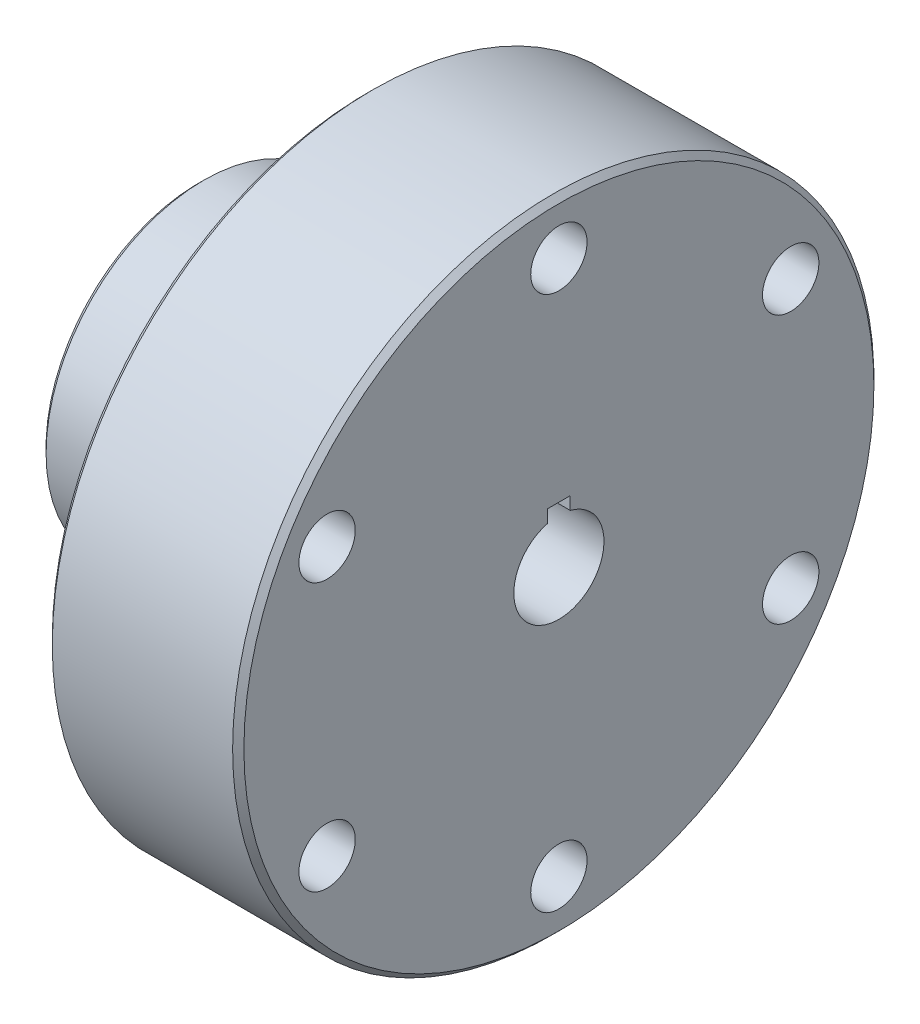
ISO-10303-21;
HEADER;
FILE_DESCRIPTION(('STEP AP214'),'2;1');
FILE_NAME('part.step','',(''),(''),'','','');
FILE_SCHEMA(('AUTOMOTIVE_DESIGN { 1 0 10303 214 1 1 1 1 }'));
ENDSEC;
DATA;
#1=APPLICATION_CONTEXT('core data for automotive mechanical design processes');
#2=APPLICATION_PROTOCOL_DEFINITION('international standard','automotive_design',2000,#1);
#3=PRODUCT_CONTEXT('',#1,'mechanical');
#4=PRODUCT('Part','Part','',(#3));
#5=PRODUCT_RELATED_PRODUCT_CATEGORY('part','',(#4));
#6=PRODUCT_DEFINITION_FORMATION('','',#4);
#7=PRODUCT_DEFINITION_CONTEXT('part definition',#1,'design');
#8=PRODUCT_DEFINITION('design','',#6,#7);
#9=PRODUCT_DEFINITION_SHAPE('','',#8);
#10=(LENGTH_UNIT() NAMED_UNIT(*) SI_UNIT(.MILLI.,.METRE.));
#11=(NAMED_UNIT(*) PLANE_ANGLE_UNIT() SI_UNIT($,.RADIAN.));
#12=(NAMED_UNIT(*) SI_UNIT($,.STERADIAN.) SOLID_ANGLE_UNIT());
#13=UNCERTAINTY_MEASURE_WITH_UNIT(LENGTH_MEASURE(1.E-05),#10,'distance_accuracy_value','');
#14=(GEOMETRIC_REPRESENTATION_CONTEXT(3) GLOBAL_UNCERTAINTY_ASSIGNED_CONTEXT((#13)) GLOBAL_UNIT_ASSIGNED_CONTEXT((#10,
#11,#12)) REPRESENTATION_CONTEXT('',''));
#15=CARTESIAN_POINT('',(0.,0.,0.));
#16=DIRECTION('',(0.,0.,1.));
#17=DIRECTION('',(1.,0.,0.));
#18=AXIS2_PLACEMENT_3D('',#15,#16,#17);
#19=CARTESIAN_POINT('',(-36.3800163800164,0.,0.));
#20=DIRECTION('',(-1.,0.,0.));
#21=DIRECTION('',(0.,0.,1.));
#22=AXIS2_PLACEMENT_3D('',#19,#20,#21);
#23=CYLINDRICAL_SURFACE('',#22,4.);
#24=CARTESIAN_POINT('',(-7.,0.,-4.));
#25=CARTESIAN_POINT('',(-7.00000074201897,-0.0732613677680275,-3.99999929901188));
#26=CARTESIAN_POINT('',(-7.00269050698686,-0.146542351053628,-3.99798060344642));
#27=CARTESIAN_POINT('',(-7.013394860135,-0.292508538993505,-3.98996245699389));
#28=CARTESIAN_POINT('',(-7.0214126345048,-0.365193360793216,-3.98396062416368));
#29=CARTESIAN_POINT('',(-7.05333590602824,-0.581731406983922,-3.96012745087106));
#30=CARTESIAN_POINT('',(-7.08511095799108,-0.723892660392385,-3.93646888013437));
#31=CARTESIAN_POINT('',(-7.16742520757524,-0.998506639011302,-3.87591490407891));
#32=CARTESIAN_POINT('',(-7.21785034838289,-1.13101263465653,-3.8391000031407));
#33=CARTESIAN_POINT('',(-7.33508536693153,-1.38483526994092,-3.75501017021524));
#34=CARTESIAN_POINT('',(-7.40189045158351,-1.50615516858413,-3.70773829853535));
#35=CARTESIAN_POINT('',(-7.55652372522062,-1.74693213195157,-3.60099357013528));
#36=CARTESIAN_POINT('',(-7.64572585127334,-1.86517631030519,-3.54079623314279));
#37=CARTESIAN_POINT('',(-7.83900049584301,-2.08606449940779,-3.41533027981217));
#38=CARTESIAN_POINT('',(-7.94309597244776,-2.18868391091458,-3.35005390635212));
#39=CARTESIAN_POINT('',(-8.12053534410459,-2.33993228026195,-3.24492237261661));
#40=CARTESIAN_POINT('',(-8.18963011240945,-2.39379458304144,-3.2052891581058));
#41=CARTESIAN_POINT('',(-8.33258913082427,-2.49548358548255,-3.12676887933752));
#42=CARTESIAN_POINT('',(-8.40645480905104,-2.54330846513548,-3.08788204306059));
#43=CARTESIAN_POINT('',(-8.55877179488022,-2.63261178619331,-3.01210562553027));
#44=CARTESIAN_POINT('',(-8.6372174379625,-2.67409784691839,-2.97521368143219));
#45=CARTESIAN_POINT('',(-8.79870704754895,-2.75043132677141,-2.90479339731391));
#46=CARTESIAN_POINT('',(-8.88175026671391,-2.78527982077503,-2.87126451310281));
#47=CARTESIAN_POINT('',(-9.07896227542374,-2.85760090658949,-2.7995453278082));
#48=CARTESIAN_POINT('',(-9.19476977393461,-2.89251037008408,-2.76315561923756));
#49=CARTESIAN_POINT('',(-9.43279706313414,-2.94841656316143,-2.70343128888205));
#50=CARTESIAN_POINT('',(-9.55500147433672,-2.96944514417499,-2.6800667983994));
#51=CARTESIAN_POINT('',(-9.80436202447177,-2.99625559824299,-2.65007535494332));
#52=CARTESIAN_POINT('',(-9.93155277328337,-3.00189887157292,-2.64360057658759));
#53=CARTESIAN_POINT('',(-10.1852306622291,-2.99696449042943,-2.64919059245027));
#54=CARTESIAN_POINT('',(-10.311717533795,-2.98638102048541,-2.66126203341492));
#55=CARTESIAN_POINT('',(-10.5463825040596,-2.95195473462658,-2.69935247502784));
#56=CARTESIAN_POINT('',(-10.6550726901358,-2.92964971367058,-2.72374314386008));
#57=CARTESIAN_POINT('',(-10.8668778094483,-2.87411343637384,-2.78228385423355));
#58=CARTESIAN_POINT('',(-10.9699872726139,-2.84087167817736,-2.81644327194564));
#59=CARTESIAN_POINT('',(-11.2325127456874,-2.74066127604793,-2.91483538729993));
#60=CARTESIAN_POINT('',(-11.3868008258836,-2.6656029678939,-2.98451298316589));
#61=CARTESIAN_POINT('',(-11.6783930551597,-2.49236046828095,-3.13066596252173));
#62=CARTESIAN_POINT('',(-11.8156546805156,-2.39412008565051,-3.20715757761232));
#63=CARTESIAN_POINT('',(-12.0755067787506,-2.17303208149636,-3.36103344637552));
#64=CARTESIAN_POINT('',(-12.1976412132322,-2.04962751039984,-3.43839173465928));
#65=CARTESIAN_POINT('',(-12.420527294092,-1.78084504353984,-3.58496075956505));
#66=CARTESIAN_POINT('',(-12.5213198405287,-1.63551010852546,-3.65418696517002));
#67=CARTESIAN_POINT('',(-12.6799615984263,-1.3558041609579,-3.76559452155695));
#68=CARTESIAN_POINT('',(-12.7423691885745,-1.2250797406269,-3.81041541916802));
#69=CARTESIAN_POINT('',(-12.8484497607849,-0.952704346148676,-3.88745808807125));
#70=CARTESIAN_POINT('',(-12.8921344763732,-0.811060281155404,-3.91968774910057));
#71=CARTESIAN_POINT('',(-12.9585067264021,-0.519352465945111,-3.96891177371226));
#72=CARTESIAN_POINT('',(-12.9810643602572,-0.36924256647749,-3.98581186314606));
#73=CARTESIAN_POINT('',(-13.0030991923644,-0.0664024759297837,-4.00231766947938));
#74=CARTESIAN_POINT('',(-13.0025861285056,0.0863265824213213,-4.0019306830649));
#75=CARTESIAN_POINT('',(-12.9797782694453,0.373608422358567,-3.98485095596869));
#76=CARTESIAN_POINT('',(-12.9596789546577,0.508444611327579,-3.96980177630783));
#77=CARTESIAN_POINT('',(-12.9020524115432,0.77222138499223,-3.92702635972251));
#78=CARTESIAN_POINT('',(-12.8645214748398,0.901160708783225,-3.89929742534594));
#79=CARTESIAN_POINT('',(-12.7722250483285,1.15483339082487,-3.83199678428177));
#80=CARTESIAN_POINT('',(-12.7168980524501,1.27925770587446,-3.79204165281684));
#81=CARTESIAN_POINT('',(-12.5916546737865,1.51703769337243,-3.70333906113672));
#82=CARTESIAN_POINT('',(-12.5217362727012,1.63039183139361,-3.65459038471486));
#83=CARTESIAN_POINT('',(-12.356435318386,1.86302046499997,-3.54238575945113));
#84=CARTESIAN_POINT('',(-12.2587502052204,1.98012231440924,-3.47783324855999));
#85=CARTESIAN_POINT('',(-12.0479751943654,2.19745073328883,-3.34476768394493));
#86=CARTESIAN_POINT('',(-11.9348511853368,2.29763880438282,-3.27624605925973));
#87=CARTESIAN_POINT('',(-11.7431701696575,2.44323760962616,-3.16783641864784));
#88=CARTESIAN_POINT('',(-11.6691421417943,2.49441207840987,-3.12757855224153));
#89=CARTESIAN_POINT('',(-11.5161732778725,2.59024776181559,-3.04868523124073));
#90=CARTESIAN_POINT('',(-11.4372306519145,2.63490658340165,-3.01005037642924));
#91=CARTESIAN_POINT('',(-11.1934171318121,2.75840992843588,-2.89884735629486));
#92=CARTESIAN_POINT('',(-11.0209781238401,2.8272286655462,-2.83062934493711));
#93=CARTESIAN_POINT('',(-10.7291537657546,2.91232161832907,-2.74237306217227));
#94=CARTESIAN_POINT('',(-10.6152131595087,2.93862206696069,-2.71391502535151));
#95=CARTESIAN_POINT('',(-10.3825904834344,2.97782857114492,-2.67084233048458));
#96=CARTESIAN_POINT('',(-10.2639196166269,2.99076452454843,-2.65619677881271));
#97=CARTESIAN_POINT('',(-10.0243408049391,3.00230698654587,-2.64315167964507));
#98=CARTESIAN_POINT('',(-9.90342458554555,3.00084075038308,-2.64483460597191));
#99=CARTESIAN_POINT('',(-9.66388585032169,2.98353723231362,-2.66432917886907));
#100=CARTESIAN_POINT('',(-9.5452664961795,2.96768140541027,-2.6821616385503));
#101=CARTESIAN_POINT('',(-9.28817442441491,2.91787829237152,-2.73634639677126));
#102=CARTESIAN_POINT('',(-9.15102076535945,2.88073715900693,-2.77589185811732));
#103=CARTESIAN_POINT('',(-8.88691513829303,2.78938673066517,-2.86766153434689));
#104=CARTESIAN_POINT('',(-8.75998996808801,2.73513432117034,-2.91991769887724));
#105=CARTESIAN_POINT('',(-8.55672752016522,2.63161322454641,-3.01293440174582));
#106=CARTESIAN_POINT('',(-8.47738514370473,2.58648316812389,-3.05189072454863));
#107=CARTESIAN_POINT('',(-8.32368527646729,2.48962257782424,-3.13140535919093));
#108=CARTESIAN_POINT('',(-8.24932751996647,2.43789239621906,-3.17196358545146));
#109=CARTESIAN_POINT('',(-8.1056445392896,2.3280042997317,-3.25347248479454));
#110=CARTESIAN_POINT('',(-8.03632365123924,2.26984095281448,-3.29442346245137));
#111=CARTESIAN_POINT('',(-7.90297982513371,2.14725580217518,-3.37560324351169));
#112=CARTESIAN_POINT('',(-7.83895714844267,2.08283369004463,-3.41583201121153));
#113=CARTESIAN_POINT('',(-7.71602666692276,1.94728190281497,-3.49489651383712));
#114=CARTESIAN_POINT('',(-7.65716691863948,1.87609990910416,-3.53371751668993));
#115=CARTESIAN_POINT('',(-7.54567024293732,1.72767987087954,-3.60860502556332));
#116=CARTESIAN_POINT('',(-7.49303200820527,1.65044310433566,-3.64467210969301));
#117=CARTESIAN_POINT('',(-7.39465805794525,1.49030317410494,-3.71302541445824));
#118=CARTESIAN_POINT('',(-7.34891040356803,1.40741018139535,-3.74531815238));
#119=CARTESIAN_POINT('',(-7.26494328395667,1.23634243548295,-3.80521640467829));
#120=CARTESIAN_POINT('',(-7.22671993349348,1.14817043896909,-3.83282433706669));
#121=CARTESIAN_POINT('',(-7.14443730103296,0.929739140257564,-3.89270294176923));
#122=CARTESIAN_POINT('',(-7.1044756371824,0.797123031202031,-3.92219862865416));
#123=CARTESIAN_POINT('',(-7.04315512041073,0.525667463530611,-3.96768259876896));
#124=CARTESIAN_POINT('',(-7.02174431321158,0.386846538130236,-3.9837086019408));
#125=CARTESIAN_POINT('',(-7.00679070137652,0.205928000583113,-3.99490938201699));
#126=CARTESIAN_POINT('',(-7.00424689717904,0.164816108820172,-3.99681576437034));
#127=CARTESIAN_POINT('',(-7.00085120146832,0.0824715620593108,-3.99936137264782));
#128=CARTESIAN_POINT('',(-6.99999958231686,0.041238888690657,-4.00000039458683));
#129=CARTESIAN_POINT('',(-7.,0.,-4.));
#130=B_SPLINE_CURVE_WITH_KNOTS('',3,(#24,#25,#26,#27,#28,#29,#30,#31,#32,#33,#34,#35,#36,#37,
#38,#39,#40,#41,#42,#43,#44,#45,#46,#47,#48,#49,#50,#51,#52,#53,#54,#55,#56,#57,#58,#59,#60,#61,
#62,#63,#64,#65,#66,#67,#68,#69,#70,#71,#72,#73,#74,#75,#76,#77,#78,#79,#80,#81,#82,#83,#84,#85,
#86,#87,#88,#89,#90,#91,#92,#93,#94,#95,#96,#97,#98,#99,#100,#101,#102,#103,#104,#105,#106,#107,
#108,#109,#110,#111,#112,#113,#114,#115,#116,#117,#118,#119,#120,#121,#122,#123,#124,#125,#126,
#127,#128,#129),.UNSPECIFIED.,.T.,.F.,(4,2,2,2,2,2,2,2,2,2,2,2,2,2,2,2,2,2,2,2,2,2,2,2,2,2,2,2,
2,2,2,2,2,2,2,2,2,2,2,2,2,2,2,2,2,2,2,2,2,2,2,2,4),(0.,0.219733524191398,0.439598569068991,
0.879847634771395,1.31744766307167,1.75491979362349,2.2329036222735,2.71163236402816,
2.99983518527188,3.28812468015057,3.57606487508902,3.86395840178997,4.24151729125786,
4.61820678456564,4.99827867308497,5.37848680666403,5.71806472391401,6.05796967267263,
6.61051355677803,7.16441076781762,7.73224459942164,8.29898017053365,8.75205702078762,
9.20484951352218,9.6604080839978,10.1157743699921,10.5253506608997,10.9350141243761,
11.3591357103334,11.7833160002107,12.2783345622972,12.7744651003689,13.0698938265096,
13.3654307846348,13.9540907813181,14.3138420927746,14.6727868466003,15.033545541411,
15.3947698355934,15.8348522835191,16.2760525671149,16.5734564783342,16.8708445226935,
17.1684856206864,17.466141392762,17.7663250552984,18.0664455283281,18.3660398682404,
18.6654791022959,19.0884486476651,19.5102297424976,19.6338980344064,19.7575862294511),.UNSPECIFIED.);
#131=CARTESIAN_POINT('',(-7.,0.,-4.));
#132=VERTEX_POINT('',#131);
#133=EDGE_CURVE('E98',#132,#132,#130,.T.);
#134=ORIENTED_EDGE('',*,*,#133,.T.);
#135=EDGE_LOOP('',(#134));
#136=FACE_BOUND('',#135,.T.);
#137=CARTESIAN_POINT('',(17.,0.,0.));
#138=DIRECTION('',(-1.,0.,0.));
#139=DIRECTION('',(0.,0.,1.));
#140=AXIS2_PLACEMENT_3D('',#137,#138,#139);
#141=CIRCLE('',#140,4.);
#142=CARTESIAN_POINT('',(17.,3.87298334620742,-0.999999999999997));
#143=VERTEX_POINT('',#142);
#144=CARTESIAN_POINT('',(17.,3.87298334620741,1.));
#145=VERTEX_POINT('',#144);
#146=EDGE_CURVE('E138',#143,#145,#141,.T.);
#147=ORIENTED_EDGE('',*,*,#146,.F.);
#148=DIRECTION('',(-1.,0.,0.));
#149=VECTOR('',#148,1.);
#150=CARTESIAN_POINT('',(-36.3800163800164,3.87298334620741,-0.999999999999996));
#151=LINE('',#150,#149);
#152=CARTESIAN_POINT('',(-15.,3.87298334620741,-0.999999999999997));
#153=VERTEX_POINT('',#152);
#154=EDGE_CURVE('E56',#143,#153,#151,.T.);
#155=ORIENTED_EDGE('',*,*,#154,.T.);
#156=CARTESIAN_POINT('',(-15.,0.,0.));
#157=DIRECTION('',(-1.,0.,0.));
#158=DIRECTION('',(0.,0.,1.));
#159=AXIS2_PLACEMENT_3D('',#156,#157,#158);
#160=CIRCLE('',#159,3.99999999999999);
#161=CARTESIAN_POINT('',(-15.,3.87298334620741,1.));
#162=VERTEX_POINT('',#161);
#163=EDGE_CURVE('E148',#153,#162,#160,.T.);
#164=ORIENTED_EDGE('',*,*,#163,.T.);
#165=DIRECTION('',(-1.,0.,0.));
#166=VECTOR('',#165,1.);
#167=CARTESIAN_POINT('',(-36.3800163800164,3.87298334620741,1.));
#168=LINE('',#167,#166);
#169=EDGE_CURVE('E79',#162,#145,#168,.F.);
#170=ORIENTED_EDGE('',*,*,#169,.T.);
#171=EDGE_LOOP('',(#147,#155,#164,#170));
#172=FACE_BOUND('',#171,.T.);
#173=ADVANCED_FACE('F33',(#136,#172),#23,.F.);
#174=CARTESIAN_POINT('',(-15.,3.99999999999999,0.));
#175=DIRECTION('',(1.,0.,0.));
#176=DIRECTION('',(0.,0.,-1.));
#177=AXIS2_PLACEMENT_3D('',#174,#175,#176);
#178=PLANE('',#177);
#179=CARTESIAN_POINT('',(-15.,0.,0.));
#180=DIRECTION('',(1.,0.,0.));
#181=DIRECTION('',(0.,0.,-1.));
#182=AXIS2_PLACEMENT_3D('',#179,#180,#181);
#183=CIRCLE('',#182,13.5);
#184=CARTESIAN_POINT('',(-15.,0.,-13.5));
#185=VERTEX_POINT('',#184);
#186=EDGE_CURVE('E41',#185,#185,#183,.F.);
#187=ORIENTED_EDGE('',*,*,#186,.T.);
#188=EDGE_LOOP('',(#187));
#189=FACE_BOUND('',#188,.T.);
#190=ORIENTED_EDGE('',*,*,#163,.F.);
#191=DIRECTION('',(0.,-1.,0.));
#192=VECTOR('',#191,1.);
#193=CARTESIAN_POINT('',(-15.,5.,-0.999999999999997));
#194=LINE('',#193,#192);
#195=CARTESIAN_POINT('',(-15.,5.,-0.999999999999997));
#196=VERTEX_POINT('',#195);
#197=EDGE_CURVE('E95',#196,#153,#194,.T.);
#198=ORIENTED_EDGE('',*,*,#197,.F.);
#199=DIRECTION('',(0.,0.,-1.));
#200=VECTOR('',#199,1.);
#201=CARTESIAN_POINT('',(-15.,5.,-0.999999999999997));
#202=LINE('',#201,#200);
#203=CARTESIAN_POINT('',(-15.,5.,1.));
#204=VERTEX_POINT('',#203);
#205=EDGE_CURVE('E77',#204,#196,#202,.T.);
#206=ORIENTED_EDGE('',*,*,#205,.F.);
#207=DIRECTION('',(0.,1.,0.));
#208=VECTOR('',#207,1.);
#209=CARTESIAN_POINT('',(-15.,5.,1.));
#210=LINE('',#209,#208);
#211=EDGE_CURVE('E97',#162,#204,#210,.T.);
#212=ORIENTED_EDGE('',*,*,#211,.F.);
#213=EDGE_LOOP('',(#190,#198,#206,#212));
#214=FACE_BOUND('',#213,.T.);
#215=ADVANCED_FACE('F180',(#189,#214),#178,.F.);
#216=CARTESIAN_POINT('',(-36.3800163800164,0.,0.));
#217=DIRECTION('',(-1.,0.,0.));
#218=DIRECTION('',(0.,0.,1.));
#219=AXIS2_PLACEMENT_3D('',#216,#217,#218);
#220=CYLINDRICAL_SURFACE('',#219,14.);
#221=CARTESIAN_POINT('',(-14.5,0.,0.));
#222=DIRECTION('',(1.,0.,0.));
#223=DIRECTION('',(0.,0.,-1.));
#224=AXIS2_PLACEMENT_3D('',#221,#222,#223);
#225=CIRCLE('',#224,14.);
#226=CARTESIAN_POINT('',(-14.5,0.,-14.));
#227=VERTEX_POINT('',#226);
#228=EDGE_CURVE('E11',#227,#227,#225,.T.);
#229=ORIENTED_EDGE('',*,*,#228,.T.);
#230=EDGE_LOOP('',(#229));
#231=FACE_BOUND('',#230,.T.);
#232=CARTESIAN_POINT('',(-7.,0.,-14.));
#233=CARTESIAN_POINT('',(-7.0000057991486,0.166471772181233,-13.9999969208645));
#234=CARTESIAN_POINT('',(-7.01390321677571,0.333014391200549,-13.9970005189942));
#235=CARTESIAN_POINT('',(-7.06907131370718,0.661374688586655,-13.9853365965545));
#236=CARTESIAN_POINT('',(-7.11036208838987,0.823188807142381,-13.976664912742));
#237=CARTESIAN_POINT('',(-7.21896872921607,1.13729864763547,-13.9546166357765));
#238=CARTESIAN_POINT('',(-7.28625795876263,1.28960392689311,-13.9412448593434));
#239=CARTESIAN_POINT('',(-7.44486817234252,1.58075635592158,-13.9112421363594));
#240=CARTESIAN_POINT('',(-7.53618833849988,1.71960396349474,-13.8946113007332));
#241=CARTESIAN_POINT('',(-7.74176059934701,1.98204958107046,-13.8596273849262));
#242=CARTESIAN_POINT('',(-7.85631244379705,2.1054100683889,-13.8412536628652));
#243=CARTESIAN_POINT('',(-8.10445263137039,2.3313208477887,-13.8050013962829));
#244=CARTESIAN_POINT('',(-8.23804261650251,2.43386934301816,-13.7871228946326));
#245=CARTESIAN_POINT('',(-8.52221150572086,2.61628408759617,-13.7536823209445));
#246=CARTESIAN_POINT('',(-8.67295503551242,2.69589916670018,-13.7381467268872));
#247=CARTESIAN_POINT('',(-8.98606890753367,2.82857647382295,-13.7114465111707));
#248=CARTESIAN_POINT('',(-9.14843791698515,2.88164174003431,-13.7002813894142));
#249=CARTESIAN_POINT('',(-9.47762217317615,2.95893148844909,-13.6837961785262));
#250=CARTESIAN_POINT('',(-9.64433455132773,2.98357559496685,-13.6783911379297));
#251=CARTESIAN_POINT('',(-9.97960846501399,3.00462790413154,-13.6737827969021));
#252=CARTESIAN_POINT('',(-10.1481697803599,3.00103943329259,-13.6745787658346));
#253=CARTESIAN_POINT('',(-10.4792493758676,2.96606652681723,-13.6822055320766));
#254=CARTESIAN_POINT('',(-10.6418217782003,2.93516797298817,-13.6889308336432));
#255=CARTESIAN_POINT('',(-10.9594204805787,2.84722108597354,-13.7074918675157));
#256=CARTESIAN_POINT('',(-11.1144463720646,2.79017133872932,-13.719327876168));
#257=CARTESIAN_POINT('',(-11.4139257457467,2.65109102151982,-13.7468816151145));
#258=CARTESIAN_POINT('',(-11.5582890254251,2.5688722194566,-13.7626284196673));
#259=CARTESIAN_POINT('',(-11.8313503299159,2.38192014567986,-13.7962114500258));
#260=CARTESIAN_POINT('',(-11.9600462973724,2.27718392207124,-13.8140479496379));
#261=CARTESIAN_POINT('',(-12.2009187113468,2.04559085510641,-13.8502543678776));
#262=CARTESIAN_POINT('',(-12.3126974131695,1.91832046792882,-13.8686276794435));
#263=CARTESIAN_POINT('',(-12.5133874673793,1.64663461253819,-13.9035003499412));
#264=CARTESIAN_POINT('',(-12.6022984372008,1.5022188575508,-13.9199996775194));
#265=CARTESIAN_POINT('',(-12.7548213598139,1.19986692409992,-13.9493155706801));
#266=CARTESIAN_POINT('',(-12.818382825156,1.04190451772697,-13.9621247728671));
#267=CARTESIAN_POINT('',(-12.9179512966422,0.717206293371414,-13.9825621849067));
#268=CARTESIAN_POINT('',(-12.9539621451266,0.550471702267339,-13.9901911172077));
#269=CARTESIAN_POINT('',(-12.9968324282868,0.216375341673259,-13.9993061269562));
#270=CARTESIAN_POINT('',(-13.0042354257636,0.04908635454323,-14.0009067304213));
#271=CARTESIAN_POINT('',(-12.9911508577497,-0.284337947300809,-13.9981049787194));
#272=CARTESIAN_POINT('',(-12.9706651040741,-0.45047333625451,-13.993703013514));
#273=CARTESIAN_POINT('',(-12.9028355126766,-0.775085075965611,-13.9794628609053));
#274=CARTESIAN_POINT('',(-12.8557752610549,-0.933623425816954,-13.9696821009092));
#275=CARTESIAN_POINT('',(-12.7364461140104,-1.24055690094684,-13.9457784884302));
#276=CARTESIAN_POINT('',(-12.6641751313767,-1.38895118517548,-13.9316552764447));
#277=CARTESIAN_POINT('',(-12.4953329138793,-1.67364279592951,-13.900350087808));
#278=CARTESIAN_POINT('',(-12.3984404101805,-1.80974515022228,-13.8831286270855));
#279=CARTESIAN_POINT('',(-12.1835303502225,-2.06395385104719,-13.8476206606969));
#280=CARTESIAN_POINT('',(-12.0655101682251,-2.18205795738399,-13.8293340228419));
#281=CARTESIAN_POINT('',(-11.8092052596257,-2.39905422115978,-13.7933634541265));
#282=CARTESIAN_POINT('',(-11.6705998015558,-2.49757074510313,-13.7756958444257));
#283=CARTESIAN_POINT('',(-11.378490807044,-2.66992830772081,-13.7433330911936));
#284=CARTESIAN_POINT('',(-11.224987906045,-2.74377039827411,-13.7286378209611));
#285=CARTESIAN_POINT('',(-10.9082554020108,-2.86419482497096,-13.7040201961478));
#286=CARTESIAN_POINT('',(-10.7450852871387,-2.9109279728255,-13.6940714916593));
#287=CARTESIAN_POINT('',(-10.4129688323327,-2.97625392170671,-13.6800237341684));
#288=CARTESIAN_POINT('',(-10.2440233775974,-2.99485101560515,-13.6759237887941));
#289=CARTESIAN_POINT('',(-9.90893531364951,-3.00319999852081,-13.6740923769631));
#290=CARTESIAN_POINT('',(-9.74280797003884,-2.99354694516622,-13.6762295303709));
#291=CARTESIAN_POINT('',(-9.41460551573482,-2.94699578812661,-13.6863352636966));
#292=CARTESIAN_POINT('',(-9.25253036122685,-2.91009797915958,-13.6943037805343));
#293=CARTESIAN_POINT('',(-8.93748268426166,-2.81038691880867,-13.7151116220831));
#294=CARTESIAN_POINT('',(-8.78448270267141,-2.74765694341773,-13.7279352844941));
#295=CARTESIAN_POINT('',(-8.4910892549863,-2.59813503191201,-13.757015291813));
#296=CARTESIAN_POINT('',(-8.35069704276991,-2.51134070602999,-13.7732719776072));
#297=CARTESIAN_POINT('',(-8.08356361254927,-2.31416580698607,-13.8077811118646));
#298=CARTESIAN_POINT('',(-7.95714060810604,-2.20335974842473,-13.8260661987785));
#299=CARTESIAN_POINT('',(-7.72448747495908,-1.96217310923924,-13.8623489959939));
#300=CARTESIAN_POINT('',(-7.61826201137559,-1.8317880187712,-13.8803466390259));
#301=CARTESIAN_POINT('',(-7.42776808098887,-1.55320629453743,-13.9142898209797));
#302=CARTESIAN_POINT('',(-7.34378678753804,-1.40480969201928,-13.9302072914125));
#303=CARTESIAN_POINT('',(-7.20209094218763,-1.0957003218812,-13.9579165220804));
#304=CARTESIAN_POINT('',(-7.14435395482993,-0.93499821172776,-13.9697118042468));
#305=CARTESIAN_POINT('',(-7.0672956297377,-0.645070435106409,-13.9856969692354));
#306=CARTESIAN_POINT('',(-7.04210713203994,-0.517434411091959,-13.9910278377653));
#307=CARTESIAN_POINT('',(-7.00845739657666,-0.259879921707693,-13.9981804830944));
#308=CARTESIAN_POINT('',(-6.99999547270788,-0.12996155017749,-14.0000024038263));
#309=CARTESIAN_POINT('',(-7.,0.,-14.));
#310=B_SPLINE_CURVE_WITH_KNOTS('',3,(#232,#233,#234,#235,#236,#237,#238,#239,#240,#241,#242,
#243,#244,#245,#246,#247,#248,#249,#250,#251,#252,#253,#254,#255,#256,#257,#258,#259,#260,#261,
#262,#263,#264,#265,#266,#267,#268,#269,#270,#271,#272,#273,#274,#275,#276,#277,#278,#279,#280,
#281,#282,#283,#284,#285,#286,#287,#288,#289,#290,#291,#292,#293,#294,#295,#296,#297,#298,#299,
#300,#301,#302,#303,#304,#305,#306,#307,#308,#309),.UNSPECIFIED.,.T.,.F.,(4,2,2,2,2,2,2,2,2,2,2,
2,2,2,2,2,2,2,2,2,2,2,2,2,2,2,2,2,2,2,2,2,2,2,2,2,2,2,4),(0.,0.498939673024164,
0.998245766439872,1.49704164885121,1.99582055729177,2.50149923763464,3.00722155837013,
3.51828858429021,4.02929711354979,4.53266016249331,5.0359639033833,5.53048950905855,
6.02504185809137,6.52338712331936,7.02179775841779,7.53054022100582,8.039291194047,
8.54905042279612,9.05873854512687,9.5586933140837,10.0586156046286,10.5533012117853,
11.0480277839687,11.5495746773561,12.0511839460897,12.5616412656707,13.0720768215161,
13.5796448081695,14.0871353445837,14.5840136108059,15.0808865021654,15.5761699941357,
16.0715026890325,16.5764590030823,17.0815318079423,17.5928382071444,18.1037066802054,
18.4932359826459,18.8827493067467),.UNSPECIFIED.);
#311=CARTESIAN_POINT('',(-7.,0.,-14.));
#312=VERTEX_POINT('',#311);
#313=EDGE_CURVE('E153',#312,#312,#310,.T.);
#314=ORIENTED_EDGE('',*,*,#313,.T.);
#315=EDGE_LOOP('',(#314));
#316=FACE_BOUND('',#315,.T.);
#317=CARTESIAN_POINT('',(-5.,0.,0.));
#318=DIRECTION('',(-1.,0.,0.));
#319=DIRECTION('',(0.,0.,1.));
#320=AXIS2_PLACEMENT_3D('',#317,#318,#319);
#321=CIRCLE('',#320,14.);
#322=CARTESIAN_POINT('',(-5.,0.,14.));
#323=VERTEX_POINT('',#322);
#324=EDGE_CURVE('E145',#323,#323,#321,.T.);
#325=ORIENTED_EDGE('',*,*,#324,.T.);
#326=EDGE_LOOP('',(#325));
#327=FACE_BOUND('',#326,.T.);
#328=ADVANCED_FACE('F161',(#231,#316,#327),#220,.T.);
#329=CARTESIAN_POINT('',(-5.,14.,0.));
#330=DIRECTION('',(1.,0.,0.));
#331=DIRECTION('',(0.,0.,-1.));
#332=AXIS2_PLACEMENT_3D('',#329,#330,#331);
#333=PLANE('',#332);
#334=CARTESIAN_POINT('',(-5.,0.,0.));
#335=DIRECTION('',(1.,0.,0.));
#336=DIRECTION('',(0.,0.,-1.));
#337=AXIS2_PLACEMENT_3D('',#334,#335,#336);
#338=CIRCLE('',#337,14.5);
#339=CARTESIAN_POINT('',(-5.,0.,-14.5));
#340=VERTEX_POINT('',#339);
#341=EDGE_CURVE('E201',#340,#340,#338,.F.);
#342=ORIENTED_EDGE('',*,*,#341,.T.);
#343=EDGE_LOOP('',(#342));
#344=FACE_BOUND('',#343,.T.);
#345=ORIENTED_EDGE('',*,*,#324,.F.);
#346=EDGE_LOOP('',(#345));
#347=FACE_BOUND('',#346,.T.);
#348=ADVANCED_FACE('F265',(#344,#347),#333,.F.);
#349=CARTESIAN_POINT('',(-36.3800163800164,0.,0.));
#350=DIRECTION('',(-1.,0.,0.));
#351=DIRECTION('',(0.,0.,1.));
#352=AXIS2_PLACEMENT_3D('',#349,#350,#351);
#353=CYLINDRICAL_SURFACE('',#352,15.);
#354=CARTESIAN_POINT('',(-4.5,0.,0.));
#355=DIRECTION('',(1.,0.,0.));
#356=DIRECTION('',(0.,0.,-1.));
#357=AXIS2_PLACEMENT_3D('',#354,#355,#356);
#358=CIRCLE('',#357,15.);
#359=CARTESIAN_POINT('',(-4.5,0.,-15.));
#360=VERTEX_POINT('',#359);
#361=EDGE_CURVE('E198',#360,#360,#358,.T.);
#362=ORIENTED_EDGE('',*,*,#361,.T.);
#363=EDGE_LOOP('',(#362));
#364=FACE_BOUND('',#363,.T.);
#365=CARTESIAN_POINT('',(0.,0.,0.));
#366=DIRECTION('',(-1.,0.,0.));
#367=DIRECTION('',(0.,0.,1.));
#368=AXIS2_PLACEMENT_3D('',#365,#366,#367);
#369=CIRCLE('',#368,15.);
#370=CARTESIAN_POINT('',(0.,0.,15.));
#371=VERTEX_POINT('',#370);
#372=EDGE_CURVE('E142',#371,#371,#369,.T.);
#373=ORIENTED_EDGE('',*,*,#372,.T.);
#374=EDGE_LOOP('',(#373));
#375=FACE_BOUND('',#374,.T.);
#376=ADVANCED_FACE('F262',(#364,#375),#353,.T.);
#377=CARTESIAN_POINT('',(0.,15.,0.));
#378=DIRECTION('',(1.,0.,0.));
#379=DIRECTION('',(0.,0.,-1.));
#380=AXIS2_PLACEMENT_3D('',#377,#378,#379);
#381=PLANE('',#380);
#382=CARTESIAN_POINT('',(0.,0.,0.));
#383=DIRECTION('',(1.,0.,0.));
#384=DIRECTION('',(0.,0.,-1.));
#385=AXIS2_PLACEMENT_3D('',#382,#383,#384);
#386=CIRCLE('',#385,27.95);
#387=CARTESIAN_POINT('',(0.,0.,-27.95));
#388=VERTEX_POINT('',#387);
#389=EDGE_CURVE('E203',#388,#388,#386,.F.);
#390=ORIENTED_EDGE('',*,*,#389,.T.);
#391=EDGE_LOOP('',(#390));
#392=FACE_BOUND('',#391,.T.);
#393=CARTESIAN_POINT('',(0.,11.8750000000009,20.5681033398809));
#394=DIRECTION('',(-1.,0.,0.));
#395=DIRECTION('',(0.,0.,1.));
#396=AXIS2_PLACEMENT_3D('',#393,#394,#395);
#397=CIRCLE('',#396,2.50000000000029);
#398=CARTESIAN_POINT('',(0.,11.8750000000009,23.0681033398812));
#399=VERTEX_POINT('',#398);
#400=EDGE_CURVE('E109',#399,#399,#397,.T.);
#401=ORIENTED_EDGE('',*,*,#400,.F.);
#402=EDGE_LOOP('',(#401));
#403=FACE_BOUND('',#402,.T.);
#404=CARTESIAN_POINT('',(0.,-11.8749999999991,20.5681033398819));
#405=DIRECTION('',(-1.,0.,0.));
#406=DIRECTION('',(0.,0.,1.));
#407=AXIS2_PLACEMENT_3D('',#404,#405,#406);
#408=CIRCLE('',#407,2.50000000000131);
#409=CARTESIAN_POINT('',(0.,-11.8749999999991,23.0681033398832));
#410=VERTEX_POINT('',#409);
#411=EDGE_CURVE('E115',#410,#410,#408,.T.);
#412=ORIENTED_EDGE('',*,*,#411,.F.);
#413=EDGE_LOOP('',(#412));
#414=FACE_BOUND('',#413,.T.);
#415=CARTESIAN_POINT('',(0.,-23.75,2.02096112761491E-12));
#416=DIRECTION('',(-1.,0.,0.));
#417=DIRECTION('',(0.,0.,1.));
#418=AXIS2_PLACEMENT_3D('',#415,#416,#417);
#419=CIRCLE('',#418,2.50000000000209);
#420=CARTESIAN_POINT('',(0.,-23.75,2.50000000000411));
#421=VERTEX_POINT('',#420);
#422=EDGE_CURVE('E121',#421,#421,#419,.T.);
#423=ORIENTED_EDGE('',*,*,#422,.F.);
#424=EDGE_LOOP('',(#423));
#425=FACE_BOUND('',#424,.T.);
#426=CARTESIAN_POINT('',(0.,-11.8750000000009,-20.5681033398789));
#427=DIRECTION('',(-1.,0.,0.));
#428=DIRECTION('',(0.,0.,1.));
#429=AXIS2_PLACEMENT_3D('',#426,#427,#428);
#430=CIRCLE('',#429,2.50000000000193);
#431=CARTESIAN_POINT('',(0.,-11.8750000000009,-18.068103339877));
#432=VERTEX_POINT('',#431);
#433=EDGE_CURVE('E127',#432,#432,#430,.T.);
#434=ORIENTED_EDGE('',*,*,#433,.F.);
#435=EDGE_LOOP('',(#434));
#436=FACE_BOUND('',#435,.T.);
#437=CARTESIAN_POINT('',(0.,11.8749999999991,-20.5681033398799));
#438=DIRECTION('',(-1.,0.,0.));
#439=DIRECTION('',(0.,0.,1.));
#440=AXIS2_PLACEMENT_3D('',#437,#438,#439);
#441=CIRCLE('',#440,2.50000000000103);
#442=CARTESIAN_POINT('',(0.,11.8749999999991,-18.0681033398789));
#443=VERTEX_POINT('',#442);
#444=EDGE_CURVE('E104',#443,#443,#441,.T.);
#445=ORIENTED_EDGE('',*,*,#444,.F.);
#446=EDGE_LOOP('',(#445));
#447=FACE_BOUND('',#446,.T.);
#448=CARTESIAN_POINT('',(0.,23.75,0.));
#449=DIRECTION('',(-1.,0.,0.));
#450=DIRECTION('',(0.,0.,1.));
#451=AXIS2_PLACEMENT_3D('',#448,#449,#450);
#452=CIRCLE('',#451,2.5);
#453=CARTESIAN_POINT('',(0.,23.75,2.5));
#454=VERTEX_POINT('',#453);
#455=EDGE_CURVE('E108',#454,#454,#452,.T.);
#456=ORIENTED_EDGE('',*,*,#455,.F.);
#457=EDGE_LOOP('',(#456));
#458=FACE_BOUND('',#457,.T.);
#459=ORIENTED_EDGE('',*,*,#372,.F.);
#460=EDGE_LOOP('',(#459));
#461=FACE_BOUND('',#460,.T.);
#462=ADVANCED_FACE('F258',(#392,#403,#414,#425,#436,#447,#458,#461),#381,.F.);
#463=CARTESIAN_POINT('',(-36.3800163800164,0.,0.));
#464=DIRECTION('',(-1.,0.,0.));
#465=DIRECTION('',(0.,0.,1.));
#466=AXIS2_PLACEMENT_3D('',#463,#464,#465);
#467=CYLINDRICAL_SURFACE('',#466,28.45);
#468=CARTESIAN_POINT('',(16.5,0.,0.));
#469=DIRECTION('',(-1.,0.,0.));
#470=DIRECTION('',(0.,0.,1.));
#471=AXIS2_PLACEMENT_3D('',#468,#469,#470);
#472=CIRCLE('',#471,28.45);
#473=CARTESIAN_POINT('',(16.5,0.,28.45));
#474=VERTEX_POINT('',#473);
#475=EDGE_CURVE('E432',#474,#474,#472,.T.);
#476=ORIENTED_EDGE('',*,*,#475,.T.);
#477=EDGE_LOOP('',(#476));
#478=FACE_BOUND('',#477,.T.);
#479=CARTESIAN_POINT('',(0.499999999999973,0.,0.));
#480=DIRECTION('',(1.,0.,0.));
#481=DIRECTION('',(0.,0.,-1.));
#482=AXIS2_PLACEMENT_3D('',#479,#480,#481);
#483=CIRCLE('',#482,28.45);
#484=CARTESIAN_POINT('',(0.499999999999973,0.,-28.45));
#485=VERTEX_POINT('',#484);
#486=EDGE_CURVE('E152',#485,#485,#483,.T.);
#487=ORIENTED_EDGE('',*,*,#486,.T.);
#488=EDGE_LOOP('',(#487));
#489=FACE_BOUND('',#488,.T.);
#490=ADVANCED_FACE('F254',(#478,#489),#467,.T.);
#491=CARTESIAN_POINT('',(17.,28.45,0.));
#492=DIRECTION('',(-1.,0.,0.));
#493=DIRECTION('',(0.,0.,1.));
#494=AXIS2_PLACEMENT_3D('',#491,#492,#493);
#495=PLANE('',#494);
#496=CARTESIAN_POINT('',(17.,0.,0.));
#497=DIRECTION('',(-1.,0.,0.));
#498=DIRECTION('',(0.,0.,1.));
#499=AXIS2_PLACEMENT_3D('',#496,#497,#498);
#500=CIRCLE('',#499,27.95);
#501=CARTESIAN_POINT('',(17.,0.,27.95));
#502=VERTEX_POINT('',#501);
#503=EDGE_CURVE('E207',#502,#502,#500,.F.);
#504=ORIENTED_EDGE('',*,*,#503,.T.);
#505=EDGE_LOOP('',(#504));
#506=FACE_BOUND('',#505,.T.);
#507=CARTESIAN_POINT('',(17.,11.8750000000009,20.5681033398809));
#508=DIRECTION('',(-1.,0.,0.));
#509=DIRECTION('',(0.,0.,1.));
#510=AXIS2_PLACEMENT_3D('',#507,#508,#509);
#511=CIRCLE('',#510,2.50000000000029);
#512=CARTESIAN_POINT('',(17.,11.8750000000009,23.0681033398812));
#513=VERTEX_POINT('',#512);
#514=EDGE_CURVE('E105',#513,#513,#511,.T.);
#515=ORIENTED_EDGE('',*,*,#514,.T.);
#516=EDGE_LOOP('',(#515));
#517=FACE_BOUND('',#516,.T.);
#518=CARTESIAN_POINT('',(17.,-11.8749999999991,20.5681033398819));
#519=DIRECTION('',(-1.,0.,0.));
#520=DIRECTION('',(0.,0.,1.));
#521=AXIS2_PLACEMENT_3D('',#518,#519,#520);
#522=CIRCLE('',#521,2.50000000000131);
#523=CARTESIAN_POINT('',(17.,-11.8749999999991,23.0681033398832));
#524=VERTEX_POINT('',#523);
#525=EDGE_CURVE('E112',#524,#524,#522,.T.);
#526=ORIENTED_EDGE('',*,*,#525,.T.);
#527=EDGE_LOOP('',(#526));
#528=FACE_BOUND('',#527,.T.);
#529=CARTESIAN_POINT('',(17.,-23.75,2.02096112761491E-12));
#530=DIRECTION('',(-1.,0.,0.));
#531=DIRECTION('',(0.,0.,1.));
#532=AXIS2_PLACEMENT_3D('',#529,#530,#531);
#533=CIRCLE('',#532,2.50000000000209);
#534=CARTESIAN_POINT('',(17.,-23.75,2.50000000000411));
#535=VERTEX_POINT('',#534);
#536=EDGE_CURVE('E118',#535,#535,#533,.T.);
#537=ORIENTED_EDGE('',*,*,#536,.T.);
#538=EDGE_LOOP('',(#537));
#539=FACE_BOUND('',#538,.T.);
#540=CARTESIAN_POINT('',(17.,-11.8750000000009,-20.5681033398789));
#541=DIRECTION('',(-1.,0.,0.));
#542=DIRECTION('',(0.,0.,1.));
#543=AXIS2_PLACEMENT_3D('',#540,#541,#542);
#544=CIRCLE('',#543,2.50000000000193);
#545=CARTESIAN_POINT('',(17.,-11.8750000000009,-18.068103339877));
#546=VERTEX_POINT('',#545);
#547=EDGE_CURVE('E124',#546,#546,#544,.T.);
#548=ORIENTED_EDGE('',*,*,#547,.T.);
#549=EDGE_LOOP('',(#548));
#550=FACE_BOUND('',#549,.T.);
#551=CARTESIAN_POINT('',(17.,11.8749999999991,-20.5681033398799));
#552=DIRECTION('',(-1.,0.,0.));
#553=DIRECTION('',(0.,0.,1.));
#554=AXIS2_PLACEMENT_3D('',#551,#552,#553);
#555=CIRCLE('',#554,2.50000000000103);
#556=CARTESIAN_POINT('',(17.,11.8749999999991,-18.0681033398789));
#557=VERTEX_POINT('',#556);
#558=EDGE_CURVE('E130',#557,#557,#555,.T.);
#559=ORIENTED_EDGE('',*,*,#558,.T.);
#560=EDGE_LOOP('',(#559));
#561=FACE_BOUND('',#560,.T.);
#562=CARTESIAN_POINT('',(17.,23.75,0.));
#563=DIRECTION('',(-1.,0.,0.));
#564=DIRECTION('',(0.,0.,1.));
#565=AXIS2_PLACEMENT_3D('',#562,#563,#564);
#566=CIRCLE('',#565,2.5);
#567=CARTESIAN_POINT('',(17.,23.75,2.5));
#568=VERTEX_POINT('',#567);
#569=EDGE_CURVE('E135',#568,#568,#566,.T.);
#570=ORIENTED_EDGE('',*,*,#569,.T.);
#571=EDGE_LOOP('',(#570));
#572=FACE_BOUND('',#571,.T.);
#573=DIRECTION('',(0.,0.,-1.));
#574=VECTOR('',#573,1.);
#575=CARTESIAN_POINT('',(17.,5.,-0.999999999999997));
#576=LINE('',#575,#574);
#577=CARTESIAN_POINT('',(17.,5.,1.));
#578=VERTEX_POINT('',#577);
#579=CARTESIAN_POINT('',(17.,5.,-0.999999999999997));
#580=VERTEX_POINT('',#579);
#581=EDGE_CURVE('E48',#578,#580,#576,.T.);
#582=ORIENTED_EDGE('',*,*,#581,.T.);
#583=DIRECTION('',(0.,-1.,0.));
#584=VECTOR('',#583,1.);
#585=CARTESIAN_POINT('',(17.,5.,-0.999999999999997));
#586=LINE('',#585,#584);
#587=EDGE_CURVE('E82',#580,#143,#586,.T.);
#588=ORIENTED_EDGE('',*,*,#587,.T.);
#589=ORIENTED_EDGE('',*,*,#146,.T.);
#590=DIRECTION('',(0.,1.,0.));
#591=VECTOR('',#590,1.);
#592=CARTESIAN_POINT('',(17.,28.45,1.));
#593=LINE('',#592,#591);
#594=EDGE_CURVE('E90',#145,#578,#593,.T.);
#595=ORIENTED_EDGE('',*,*,#594,.T.);
#596=EDGE_LOOP('',(#582,#588,#589,#595));
#597=FACE_BOUND('',#596,.T.);
#598=ADVANCED_FACE('F89',(#506,#517,#528,#539,#550,#561,#572,#597),#495,.F.);
#599=CARTESIAN_POINT('',(17.,23.75,0.));
#600=DIRECTION('',(-1.,0.,0.));
#601=DIRECTION('',(0.,0.,1.));
#602=AXIS2_PLACEMENT_3D('',#599,#600,#601);
#603=CYLINDRICAL_SURFACE('',#602,2.5);
#604=ORIENTED_EDGE('',*,*,#569,.F.);
#605=EDGE_LOOP('',(#604));
#606=FACE_BOUND('',#605,.T.);
#607=ORIENTED_EDGE('',*,*,#455,.T.);
#608=EDGE_LOOP('',(#607));
#609=FACE_BOUND('',#608,.T.);
#610=ADVANCED_FACE('F247',(#606,#609),#603,.F.);
#611=CARTESIAN_POINT('',(17.,11.8749999999991,-20.5681033398799));
#612=DIRECTION('',(-1.,0.,0.));
#613=DIRECTION('',(0.,0.,1.));
#614=AXIS2_PLACEMENT_3D('',#611,#612,#613);
#615=CYLINDRICAL_SURFACE('',#614,2.50000000000103);
#616=ORIENTED_EDGE('',*,*,#558,.F.);
#617=EDGE_LOOP('',(#616));
#618=FACE_BOUND('',#617,.T.);
#619=ORIENTED_EDGE('',*,*,#444,.T.);
#620=EDGE_LOOP('',(#619));
#621=FACE_BOUND('',#620,.T.);
#622=ADVANCED_FACE('F243',(#618,#621),#615,.F.);
#623=CARTESIAN_POINT('',(17.,-11.8750000000009,-20.5681033398789));
#624=DIRECTION('',(-1.,0.,0.));
#625=DIRECTION('',(0.,0.,1.));
#626=AXIS2_PLACEMENT_3D('',#623,#624,#625);
#627=CYLINDRICAL_SURFACE('',#626,2.50000000000193);
#628=ORIENTED_EDGE('',*,*,#547,.F.);
#629=EDGE_LOOP('',(#628));
#630=FACE_BOUND('',#629,.T.);
#631=ORIENTED_EDGE('',*,*,#433,.T.);
#632=EDGE_LOOP('',(#631));
#633=FACE_BOUND('',#632,.T.);
#634=ADVANCED_FACE('F239',(#630,#633),#627,.F.);
#635=CARTESIAN_POINT('',(17.,-23.75,2.02096112761491E-12));
#636=DIRECTION('',(-1.,0.,0.));
#637=DIRECTION('',(0.,0.,1.));
#638=AXIS2_PLACEMENT_3D('',#635,#636,#637);
#639=CYLINDRICAL_SURFACE('',#638,2.50000000000209);
#640=ORIENTED_EDGE('',*,*,#536,.F.);
#641=EDGE_LOOP('',(#640));
#642=FACE_BOUND('',#641,.T.);
#643=ORIENTED_EDGE('',*,*,#422,.T.);
#644=EDGE_LOOP('',(#643));
#645=FACE_BOUND('',#644,.T.);
#646=ADVANCED_FACE('F235',(#642,#645),#639,.F.);
#647=CARTESIAN_POINT('',(17.,-11.8749999999991,20.5681033398819));
#648=DIRECTION('',(-1.,0.,0.));
#649=DIRECTION('',(0.,0.,1.));
#650=AXIS2_PLACEMENT_3D('',#647,#648,#649);
#651=CYLINDRICAL_SURFACE('',#650,2.50000000000131);
#652=ORIENTED_EDGE('',*,*,#525,.F.);
#653=EDGE_LOOP('',(#652));
#654=FACE_BOUND('',#653,.T.);
#655=ORIENTED_EDGE('',*,*,#411,.T.);
#656=EDGE_LOOP('',(#655));
#657=FACE_BOUND('',#656,.T.);
#658=ADVANCED_FACE('F231',(#654,#657),#651,.F.);
#659=CARTESIAN_POINT('',(17.,11.8750000000009,20.5681033398809));
#660=DIRECTION('',(-1.,0.,0.));
#661=DIRECTION('',(0.,0.,1.));
#662=AXIS2_PLACEMENT_3D('',#659,#660,#661);
#663=CYLINDRICAL_SURFACE('',#662,2.50000000000029);
#664=ORIENTED_EDGE('',*,*,#514,.F.);
#665=EDGE_LOOP('',(#664));
#666=FACE_BOUND('',#665,.T.);
#667=ORIENTED_EDGE('',*,*,#400,.T.);
#668=EDGE_LOOP('',(#667));
#669=FACE_BOUND('',#668,.T.);
#670=ADVANCED_FACE('F226',(#666,#669),#663,.F.);
#671=CARTESIAN_POINT('',(17.,5.,-0.999999999999997));
#672=DIRECTION('',(0.,0.,-1.));
#673=DIRECTION('',(0.,1.,0.));
#674=AXIS2_PLACEMENT_3D('',#671,#672,#673);
#675=PLANE('',#674);
#676=ORIENTED_EDGE('',*,*,#587,.F.);
#677=DIRECTION('',(-1.,0.,0.));
#678=VECTOR('',#677,1.);
#679=CARTESIAN_POINT('',(17.,5.,-0.999999999999997));
#680=LINE('',#679,#678);
#681=EDGE_CURVE('E74',#580,#196,#680,.T.);
#682=ORIENTED_EDGE('',*,*,#681,.T.);
#683=ORIENTED_EDGE('',*,*,#197,.T.);
#684=ORIENTED_EDGE('',*,*,#154,.F.);
#685=EDGE_LOOP('',(#676,#682,#683,#684));
#686=FACE_BOUND('',#685,.T.);
#687=ADVANCED_FACE('F83',(#686),#675,.F.);
#688=CARTESIAN_POINT('',(17.,5.,1.));
#689=DIRECTION('',(0.,0.,1.));
#690=DIRECTION('',(0.,-1.,0.));
#691=AXIS2_PLACEMENT_3D('',#688,#689,#690);
#692=PLANE('',#691);
#693=ORIENTED_EDGE('',*,*,#211,.T.);
#694=DIRECTION('',(-1.,0.,0.));
#695=VECTOR('',#694,1.);
#696=CARTESIAN_POINT('',(17.,5.,1.));
#697=LINE('',#696,#695);
#698=EDGE_CURVE('E80',#578,#204,#697,.T.);
#699=ORIENTED_EDGE('',*,*,#698,.F.);
#700=ORIENTED_EDGE('',*,*,#594,.F.);
#701=ORIENTED_EDGE('',*,*,#169,.F.);
#702=EDGE_LOOP('',(#693,#699,#700,#701));
#703=FACE_BOUND('',#702,.T.);
#704=ADVANCED_FACE('F220',(#703),#692,.F.);
#705=CARTESIAN_POINT('',(17.,5.,-0.999999999999997));
#706=DIRECTION('',(0.,1.,0.));
#707=DIRECTION('',(0.,0.,1.));
#708=AXIS2_PLACEMENT_3D('',#705,#706,#707);
#709=PLANE('',#708);
#710=ORIENTED_EDGE('',*,*,#205,.T.);
#711=ORIENTED_EDGE('',*,*,#681,.F.);
#712=ORIENTED_EDGE('',*,*,#581,.F.);
#713=ORIENTED_EDGE('',*,*,#698,.T.);
#714=EDGE_LOOP('',(#710,#711,#712,#713));
#715=FACE_BOUND('',#714,.T.);
#716=ADVANCED_FACE('F75',(#715),#709,.F.);
#717=CARTESIAN_POINT('',(-10.,0.,-20.));
#718=DIRECTION('',(0.,0.,1.));
#719=DIRECTION('',(1.,0.,0.));
#720=AXIS2_PLACEMENT_3D('',#717,#718,#719);
#721=CYLINDRICAL_SURFACE('',#720,3.);
#722=ORIENTED_EDGE('',*,*,#313,.F.);
#723=EDGE_LOOP('',(#722));
#724=FACE_BOUND('',#723,.T.);
#725=ORIENTED_EDGE('',*,*,#133,.F.);
#726=EDGE_LOOP('',(#725));
#727=FACE_BOUND('',#726,.T.);
#728=ADVANCED_FACE('F165',(#724,#727),#721,.F.);
#729=CARTESIAN_POINT('',(16.5,0.,0.));
#730=DIRECTION('',(-1.,0.,0.));
#731=DIRECTION('',(0.,0.,1.));
#732=AXIS2_PLACEMENT_3D('',#729,#730,#731);
#733=CONICAL_SURFACE('',#732,28.45,0.785398163397452);
#734=ORIENTED_EDGE('',*,*,#503,.F.);
#735=EDGE_LOOP('',(#734));
#736=FACE_BOUND('',#735,.T.);
#737=ORIENTED_EDGE('',*,*,#475,.F.);
#738=EDGE_LOOP('',(#737));
#739=FACE_BOUND('',#738,.T.);
#740=ADVANCED_FACE('F169',(#736,#739),#733,.T.);
#741=CARTESIAN_POINT('',(0.,0.,0.));
#742=DIRECTION('',(1.,0.,0.));
#743=DIRECTION('',(0.,0.,-1.));
#744=AXIS2_PLACEMENT_3D('',#741,#742,#743);
#745=CONICAL_SURFACE('',#744,27.95,0.785398163397445);
#746=ORIENTED_EDGE('',*,*,#486,.F.);
#747=EDGE_LOOP('',(#746));
#748=FACE_BOUND('',#747,.T.);
#749=ORIENTED_EDGE('',*,*,#389,.F.);
#750=EDGE_LOOP('',(#749));
#751=FACE_BOUND('',#750,.T.);
#752=ADVANCED_FACE('F184',(#748,#751),#745,.T.);
#753=CARTESIAN_POINT('',(-5.,0.,0.));
#754=DIRECTION('',(1.,0.,0.));
#755=DIRECTION('',(0.,0.,-1.));
#756=AXIS2_PLACEMENT_3D('',#753,#754,#755);
#757=CONICAL_SURFACE('',#756,14.5,0.785398163397457);
#758=ORIENTED_EDGE('',*,*,#361,.F.);
#759=EDGE_LOOP('',(#758));
#760=FACE_BOUND('',#759,.T.);
#761=ORIENTED_EDGE('',*,*,#341,.F.);
#762=EDGE_LOOP('',(#761));
#763=FACE_BOUND('',#762,.T.);
#764=ADVANCED_FACE('F187',(#760,#763),#757,.T.);
#765=CARTESIAN_POINT('',(-15.,0.,0.));
#766=DIRECTION('',(1.,0.,0.));
#767=DIRECTION('',(0.,0.,-1.));
#768=AXIS2_PLACEMENT_3D('',#765,#766,#767);
#769=CONICAL_SURFACE('',#768,13.5,0.785398163397441);
#770=ORIENTED_EDGE('',*,*,#228,.F.);
#771=EDGE_LOOP('',(#770));
#772=FACE_BOUND('',#771,.T.);
#773=ORIENTED_EDGE('',*,*,#186,.F.);
#774=EDGE_LOOP('',(#773));
#775=FACE_BOUND('',#774,.T.);
#776=ADVANCED_FACE('F35',(#772,#775),#769,.T.);
#777=CLOSED_SHELL('',(#173,#215,#328,#348,#376,#462,#490,#598,#610,#622,#634,#646,#658,#670,
#687,#704,#716,#728,#740,#752,#764,#776));
#778=MANIFOLD_SOLID_BREP('B2',#777);
#779=ADVANCED_BREP_SHAPE_REPRESENTATION('',(#18,#778),#14);
#780=SHAPE_DEFINITION_REPRESENTATION(#9,#779);
ENDSEC;
END-ISO-10303-21;
